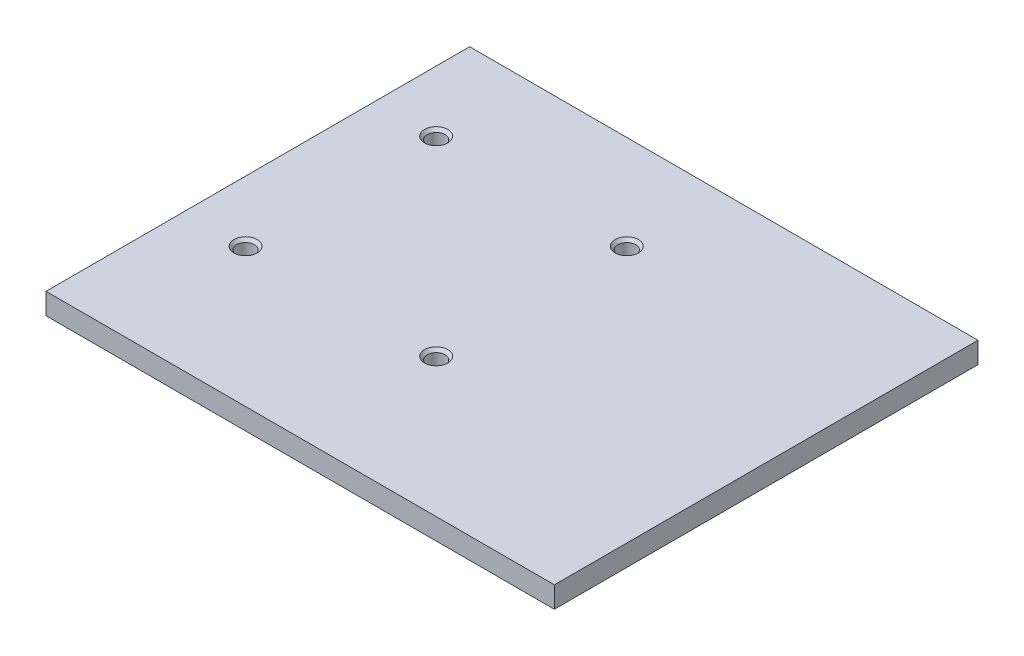
ISO-10303-21;
HEADER;
FILE_DESCRIPTION(('STEP AP214'),'2;1');
FILE_NAME('part.step','',(''),(''),'','','');
FILE_SCHEMA(('AUTOMOTIVE_DESIGN { 1 0 10303 214 1 1 1 1 }'));
ENDSEC;
DATA;
#1=APPLICATION_CONTEXT('core data for automotive mechanical design processes');
#2=APPLICATION_PROTOCOL_DEFINITION('international standard','automotive_design',2000,#1);
#3=PRODUCT_CONTEXT('',#1,'mechanical');
#4=PRODUCT('Part','Part','',(#3));
#5=PRODUCT_RELATED_PRODUCT_CATEGORY('part','',(#4));
#6=PRODUCT_DEFINITION_FORMATION('','',#4);
#7=PRODUCT_DEFINITION_CONTEXT('part definition',#1,'design');
#8=PRODUCT_DEFINITION('design','',#6,#7);
#9=PRODUCT_DEFINITION_SHAPE('','',#8);
#10=(LENGTH_UNIT() NAMED_UNIT(*) SI_UNIT(.MILLI.,.METRE.));
#11=(NAMED_UNIT(*) PLANE_ANGLE_UNIT() SI_UNIT($,.RADIAN.));
#12=(NAMED_UNIT(*) SI_UNIT($,.STERADIAN.) SOLID_ANGLE_UNIT());
#13=UNCERTAINTY_MEASURE_WITH_UNIT(LENGTH_MEASURE(1.E-05),#10,'distance_accuracy_value','');
#14=(GEOMETRIC_REPRESENTATION_CONTEXT(3) GLOBAL_UNCERTAINTY_ASSIGNED_CONTEXT((#13)) GLOBAL_UNIT_ASSIGNED_CONTEXT((#10,
#11,#12)) REPRESENTATION_CONTEXT('',''));
#15=CARTESIAN_POINT('',(0.,0.,0.));
#16=DIRECTION('',(0.,0.,1.));
#17=DIRECTION('',(1.,0.,0.));
#18=AXIS2_PLACEMENT_3D('',#15,#16,#17);
#19=CARTESIAN_POINT('',(-152.4,12.7,-127.));
#20=DIRECTION('',(1.,0.,0.));
#21=DIRECTION('',(0.,0.,-1.));
#22=AXIS2_PLACEMENT_3D('',#19,#20,#21);
#23=PLANE('',#22);
#24=DIRECTION('',(0.,0.,1.));
#25=VECTOR('',#24,1.);
#26=CARTESIAN_POINT('',(-152.4,0.,-127.));
#27=LINE('',#26,#25);
#28=CARTESIAN_POINT('',(-152.4,0.,-127.));
#29=VERTEX_POINT('',#28);
#30=CARTESIAN_POINT('',(-152.4,0.,127.));
#31=VERTEX_POINT('',#30);
#32=EDGE_CURVE('E102',#29,#31,#27,.T.);
#33=ORIENTED_EDGE('',*,*,#32,.T.);
#34=DIRECTION('',(0.,-1.,0.));
#35=VECTOR('',#34,1.);
#36=CARTESIAN_POINT('',(-152.4,12.7,127.));
#37=LINE('',#36,#35);
#38=CARTESIAN_POINT('',(-152.4,12.7,127.));
#39=VERTEX_POINT('',#38);
#40=EDGE_CURVE('E11',#39,#31,#37,.T.);
#41=ORIENTED_EDGE('',*,*,#40,.F.);
#42=DIRECTION('',(0.,0.,1.));
#43=VECTOR('',#42,1.);
#44=CARTESIAN_POINT('',(-152.4,12.7,-127.));
#45=LINE('',#44,#43);
#46=CARTESIAN_POINT('',(-152.4,12.7,-127.));
#47=VERTEX_POINT('',#46);
#48=EDGE_CURVE('E90',#47,#39,#45,.T.);
#49=ORIENTED_EDGE('',*,*,#48,.F.);
#50=DIRECTION('',(0.,-1.,0.));
#51=VECTOR('',#50,1.);
#52=CARTESIAN_POINT('',(-152.4,12.7,-127.));
#53=LINE('',#52,#51);
#54=EDGE_CURVE('E98',#47,#29,#53,.T.);
#55=ORIENTED_EDGE('',*,*,#54,.T.);
#56=EDGE_LOOP('',(#33,#41,#49,#55));
#57=FACE_BOUND('',#56,.T.);
#58=ADVANCED_FACE('F39',(#57),#23,.F.);
#59=CARTESIAN_POINT('',(-152.4,12.7,127.));
#60=DIRECTION('',(0.,0.,-1.));
#61=DIRECTION('',(-1.,0.,0.));
#62=AXIS2_PLACEMENT_3D('',#59,#60,#61);
#63=PLANE('',#62);
#64=DIRECTION('',(1.,0.,0.));
#65=VECTOR('',#64,1.);
#66=CARTESIAN_POINT('',(-152.4,0.,127.));
#67=LINE('',#66,#65);
#68=CARTESIAN_POINT('',(152.4,0.,127.));
#69=VERTEX_POINT('',#68);
#70=EDGE_CURVE('E94',#31,#69,#67,.T.);
#71=ORIENTED_EDGE('',*,*,#70,.T.);
#72=DIRECTION('',(0.,-1.,0.));
#73=VECTOR('',#72,1.);
#74=CARTESIAN_POINT('',(152.4,12.7,127.));
#75=LINE('',#74,#73);
#76=CARTESIAN_POINT('',(152.4,12.7,127.));
#77=VERTEX_POINT('',#76);
#78=EDGE_CURVE('E47',#77,#69,#75,.T.);
#79=ORIENTED_EDGE('',*,*,#78,.F.);
#80=DIRECTION('',(1.,0.,0.));
#81=VECTOR('',#80,1.);
#82=CARTESIAN_POINT('',(-152.4,12.7,127.));
#83=LINE('',#82,#81);
#84=EDGE_CURVE('E85',#39,#77,#83,.T.);
#85=ORIENTED_EDGE('',*,*,#84,.F.);
#86=ORIENTED_EDGE('',*,*,#40,.T.);
#87=EDGE_LOOP('',(#71,#79,#85,#86));
#88=FACE_BOUND('',#87,.T.);
#89=ADVANCED_FACE('F93',(#88),#63,.F.);
#90=CARTESIAN_POINT('',(152.4,12.7,-127.));
#91=DIRECTION('',(-1.,0.,0.));
#92=DIRECTION('',(0.,0.,1.));
#93=AXIS2_PLACEMENT_3D('',#90,#91,#92);
#94=PLANE('',#93);
#95=DIRECTION('',(0.,0.,-1.));
#96=VECTOR('',#95,1.);
#97=CARTESIAN_POINT('',(152.4,0.,-127.));
#98=LINE('',#97,#96);
#99=CARTESIAN_POINT('',(152.4,0.,-127.));
#100=VERTEX_POINT('',#99);
#101=EDGE_CURVE('E72',#69,#100,#98,.T.);
#102=ORIENTED_EDGE('',*,*,#101,.T.);
#103=DIRECTION('',(0.,-1.,0.));
#104=VECTOR('',#103,1.);
#105=CARTESIAN_POINT('',(152.4,12.7,-127.));
#106=LINE('',#105,#104);
#107=CARTESIAN_POINT('',(152.4,12.7,-127.));
#108=VERTEX_POINT('',#107);
#109=EDGE_CURVE('E95',#108,#100,#106,.T.);
#110=ORIENTED_EDGE('',*,*,#109,.F.);
#111=DIRECTION('',(0.,0.,-1.));
#112=VECTOR('',#111,1.);
#113=CARTESIAN_POINT('',(152.4,12.7,-127.));
#114=LINE('',#113,#112);
#115=EDGE_CURVE('E88',#77,#108,#114,.T.);
#116=ORIENTED_EDGE('',*,*,#115,.F.);
#117=ORIENTED_EDGE('',*,*,#78,.T.);
#118=EDGE_LOOP('',(#102,#110,#116,#117));
#119=FACE_BOUND('',#118,.T.);
#120=ADVANCED_FACE('F96',(#119),#94,.F.);
#121=CARTESIAN_POINT('',(-152.4,12.7,-127.));
#122=DIRECTION('',(0.,0.,1.));
#123=DIRECTION('',(1.,0.,0.));
#124=AXIS2_PLACEMENT_3D('',#121,#122,#123);
#125=PLANE('',#124);
#126=DIRECTION('',(-1.,0.,0.));
#127=VECTOR('',#126,1.);
#128=CARTESIAN_POINT('',(-152.4,0.,-127.));
#129=LINE('',#128,#127);
#130=EDGE_CURVE('E78',#100,#29,#129,.T.);
#131=ORIENTED_EDGE('',*,*,#130,.T.);
#132=ORIENTED_EDGE('',*,*,#54,.F.);
#133=DIRECTION('',(-1.,0.,0.));
#134=VECTOR('',#133,1.);
#135=CARTESIAN_POINT('',(-152.4,12.7,-127.));
#136=LINE('',#135,#134);
#137=EDGE_CURVE('E55',#108,#47,#136,.T.);
#138=ORIENTED_EDGE('',*,*,#137,.F.);
#139=ORIENTED_EDGE('',*,*,#109,.T.);
#140=EDGE_LOOP('',(#131,#132,#138,#139));
#141=FACE_BOUND('',#140,.T.);
#142=ADVANCED_FACE('F110',(#141),#125,.F.);
#143=CARTESIAN_POINT('',(0.,12.7,0.));
#144=DIRECTION('',(0.,1.,0.));
#145=DIRECTION('',(0.,0.,1.));
#146=AXIS2_PLACEMENT_3D('',#143,#144,#145);
#147=PLANE('',#146);
#148=CARTESIAN_POINT('',(-115.979474199942,12.7,-70.5188808451813));
#149=DIRECTION('',(0.,1.,0.));
#150=DIRECTION('',(0.,0.,1.));
#151=AXIS2_PLACEMENT_3D('',#148,#149,#150);
#152=CIRCLE('',#151,6.985);
#153=CARTESIAN_POINT('',(-115.979474199942,12.7,-63.5338808451813));
#154=VERTEX_POINT('',#153);
#155=EDGE_CURVE('E148',#154,#154,#152,.T.);
#156=ORIENTED_EDGE('',*,*,#155,.F.);
#157=EDGE_LOOP('',(#156));
#158=FACE_BOUND('',#157,.T.);
#159=CARTESIAN_POINT('',(-1.67947419994197,12.7,-70.5188808451813));
#160=DIRECTION('',(0.,1.,0.));
#161=DIRECTION('',(0.,0.,1.));
#162=AXIS2_PLACEMENT_3D('',#159,#160,#161);
#163=CIRCLE('',#162,6.985);
#164=CARTESIAN_POINT('',(-1.67947419994197,12.7,-63.5338808451813));
#165=VERTEX_POINT('',#164);
#166=EDGE_CURVE('E139',#165,#165,#163,.T.);
#167=ORIENTED_EDGE('',*,*,#166,.F.);
#168=EDGE_LOOP('',(#167));
#169=FACE_BOUND('',#168,.T.);
#170=CARTESIAN_POINT('',(-1.67947419994197,12.7,43.7811191548187));
#171=DIRECTION('',(0.,1.,0.));
#172=DIRECTION('',(0.,0.,1.));
#173=AXIS2_PLACEMENT_3D('',#170,#171,#172);
#174=CIRCLE('',#173,6.985);
#175=CARTESIAN_POINT('',(-1.67947419994197,12.7,50.7661191548187));
#176=VERTEX_POINT('',#175);
#177=EDGE_CURVE('E130',#176,#176,#174,.T.);
#178=ORIENTED_EDGE('',*,*,#177,.F.);
#179=EDGE_LOOP('',(#178));
#180=FACE_BOUND('',#179,.T.);
#181=CARTESIAN_POINT('',(-115.979474199942,12.7,43.7811191548188));
#182=DIRECTION('',(0.,1.,0.));
#183=DIRECTION('',(0.,0.,1.));
#184=AXIS2_PLACEMENT_3D('',#181,#182,#183);
#185=CIRCLE('',#184,6.985);
#186=CARTESIAN_POINT('',(-115.979474199942,12.7,50.7661191548188));
#187=VERTEX_POINT('',#186);
#188=EDGE_CURVE('E121',#187,#187,#185,.T.);
#189=ORIENTED_EDGE('',*,*,#188,.F.);
#190=EDGE_LOOP('',(#189));
#191=FACE_BOUND('',#190,.T.);
#192=ORIENTED_EDGE('',*,*,#48,.T.);
#193=ORIENTED_EDGE('',*,*,#84,.T.);
#194=ORIENTED_EDGE('',*,*,#115,.T.);
#195=ORIENTED_EDGE('',*,*,#137,.T.);
#196=EDGE_LOOP('',(#192,#193,#194,#195));
#197=FACE_BOUND('',#196,.T.);
#198=ADVANCED_FACE('F86',(#158,#169,#180,#191,#197),#147,.T.);
#199=CARTESIAN_POINT('',(0.,0.,0.));
#200=DIRECTION('',(0.,1.,0.));
#201=DIRECTION('',(0.,0.,1.));
#202=AXIS2_PLACEMENT_3D('',#199,#200,#201);
#203=PLANE('',#202);
#204=CARTESIAN_POINT('',(-115.979474199942,0.,-70.5188808451813));
#205=DIRECTION('',(0.,1.,0.));
#206=DIRECTION('',(0.,0.,1.));
#207=AXIS2_PLACEMENT_3D('',#204,#205,#206);
#208=CIRCLE('',#207,5.35813);
#209=CARTESIAN_POINT('',(-115.979474199942,0.,-65.1607508451813));
#210=VERTEX_POINT('',#209);
#211=EDGE_CURVE('E142',#210,#210,#208,.T.);
#212=ORIENTED_EDGE('',*,*,#211,.T.);
#213=EDGE_LOOP('',(#212));
#214=FACE_BOUND('',#213,.T.);
#215=CARTESIAN_POINT('',(-1.67947419994197,0.,-70.5188808451813));
#216=DIRECTION('',(0.,1.,0.));
#217=DIRECTION('',(0.,0.,1.));
#218=AXIS2_PLACEMENT_3D('',#215,#216,#217);
#219=CIRCLE('',#218,5.35813);
#220=CARTESIAN_POINT('',(-1.67947419994197,0.,-65.1607508451813));
#221=VERTEX_POINT('',#220);
#222=EDGE_CURVE('E133',#221,#221,#219,.T.);
#223=ORIENTED_EDGE('',*,*,#222,.T.);
#224=EDGE_LOOP('',(#223));
#225=FACE_BOUND('',#224,.T.);
#226=CARTESIAN_POINT('',(-1.67947419994197,0.,43.7811191548187));
#227=DIRECTION('',(0.,1.,0.));
#228=DIRECTION('',(0.,0.,1.));
#229=AXIS2_PLACEMENT_3D('',#226,#227,#228);
#230=CIRCLE('',#229,5.35813);
#231=CARTESIAN_POINT('',(-1.67947419994197,0.,49.1392491548187));
#232=VERTEX_POINT('',#231);
#233=EDGE_CURVE('E124',#232,#232,#230,.T.);
#234=ORIENTED_EDGE('',*,*,#233,.T.);
#235=EDGE_LOOP('',(#234));
#236=FACE_BOUND('',#235,.T.);
#237=CARTESIAN_POINT('',(-115.979474199942,0.,43.7811191548188));
#238=DIRECTION('',(0.,1.,0.));
#239=DIRECTION('',(0.,0.,1.));
#240=AXIS2_PLACEMENT_3D('',#237,#238,#239);
#241=CIRCLE('',#240,5.35813);
#242=CARTESIAN_POINT('',(-115.979474199942,0.,49.1392491548188));
#243=VERTEX_POINT('',#242);
#244=EDGE_CURVE('E105',#243,#243,#241,.T.);
#245=ORIENTED_EDGE('',*,*,#244,.T.);
#246=EDGE_LOOP('',(#245));
#247=FACE_BOUND('',#246,.T.);
#248=ORIENTED_EDGE('',*,*,#32,.F.);
#249=ORIENTED_EDGE('',*,*,#130,.F.);
#250=ORIENTED_EDGE('',*,*,#101,.F.);
#251=ORIENTED_EDGE('',*,*,#70,.F.);
#252=EDGE_LOOP('',(#248,#249,#250,#251));
#253=FACE_BOUND('',#252,.T.);
#254=ADVANCED_FACE('F113',(#214,#225,#236,#247,#253),#203,.F.);
#255=CARTESIAN_POINT('',(-115.979474199942,12.7,43.7811191548188));
#256=DIRECTION('',(0.,1.,0.));
#257=DIRECTION('',(0.,0.,1.));
#258=AXIS2_PLACEMENT_3D('',#255,#256,#257);
#259=CYLINDRICAL_SURFACE('',#258,5.35813);
#260=ORIENTED_EDGE('',*,*,#244,.F.);
#261=EDGE_LOOP('',(#260));
#262=FACE_BOUND('',#261,.T.);
#263=CARTESIAN_POINT('',(-115.979474199942,10.8285001493444,43.7811191548188));
#264=DIRECTION('',(0.,1.,0.));
#265=DIRECTION('',(0.,0.,1.));
#266=AXIS2_PLACEMENT_3D('',#263,#264,#265);
#267=CIRCLE('',#266,5.35813);
#268=CARTESIAN_POINT('',(-115.979474199942,10.8285001493444,49.1392491548188));
#269=VERTEX_POINT('',#268);
#270=EDGE_CURVE('E118',#269,#269,#267,.T.);
#271=ORIENTED_EDGE('',*,*,#270,.T.);
#272=EDGE_LOOP('',(#271));
#273=FACE_BOUND('',#272,.T.);
#274=ADVANCED_FACE('F166',(#262,#273),#259,.F.);
#275=CARTESIAN_POINT('',(-115.979474199942,12.7,43.7811191548188));
#276=DIRECTION('',(0.,1.,0.));
#277=DIRECTION('',(0.,0.,1.));
#278=AXIS2_PLACEMENT_3D('',#275,#276,#277);
#279=CONICAL_SURFACE('',#278,6.985,0.715584993317676);
#280=ORIENTED_EDGE('',*,*,#270,.F.);
#281=EDGE_LOOP('',(#280));
#282=FACE_BOUND('',#281,.T.);
#283=ORIENTED_EDGE('',*,*,#188,.T.);
#284=EDGE_LOOP('',(#283));
#285=FACE_BOUND('',#284,.T.);
#286=ADVANCED_FACE('F163',(#282,#285),#279,.F.);
#287=CARTESIAN_POINT('',(-1.67947419994197,12.7,43.7811191548187));
#288=DIRECTION('',(0.,1.,0.));
#289=DIRECTION('',(0.,0.,1.));
#290=AXIS2_PLACEMENT_3D('',#287,#288,#289);
#291=CYLINDRICAL_SURFACE('',#290,5.35813);
#292=ORIENTED_EDGE('',*,*,#233,.F.);
#293=EDGE_LOOP('',(#292));
#294=FACE_BOUND('',#293,.T.);
#295=CARTESIAN_POINT('',(-1.67947419994197,10.8285001493444,43.7811191548187));
#296=DIRECTION('',(0.,1.,0.));
#297=DIRECTION('',(0.,0.,1.));
#298=AXIS2_PLACEMENT_3D('',#295,#296,#297);
#299=CIRCLE('',#298,5.35813);
#300=CARTESIAN_POINT('',(-1.67947419994197,10.8285001493444,49.1392491548187));
#301=VERTEX_POINT('',#300);
#302=EDGE_CURVE('E127',#301,#301,#299,.T.);
#303=ORIENTED_EDGE('',*,*,#302,.T.);
#304=EDGE_LOOP('',(#303));
#305=FACE_BOUND('',#304,.T.);
#306=ADVANCED_FACE('F165',(#294,#305),#291,.F.);
#307=CARTESIAN_POINT('',(-1.67947419994197,12.7,43.7811191548187));
#308=DIRECTION('',(0.,1.,0.));
#309=DIRECTION('',(0.,0.,1.));
#310=AXIS2_PLACEMENT_3D('',#307,#308,#309);
#311=CONICAL_SURFACE('',#310,6.985,0.715584993317677);
#312=ORIENTED_EDGE('',*,*,#302,.F.);
#313=EDGE_LOOP('',(#312));
#314=FACE_BOUND('',#313,.T.);
#315=ORIENTED_EDGE('',*,*,#177,.T.);
#316=EDGE_LOOP('',(#315));
#317=FACE_BOUND('',#316,.T.);
#318=ADVANCED_FACE('F173',(#314,#317),#311,.F.);
#319=CARTESIAN_POINT('',(-1.67947419994197,12.7,-70.5188808451813));
#320=DIRECTION('',(0.,1.,0.));
#321=DIRECTION('',(0.,0.,1.));
#322=AXIS2_PLACEMENT_3D('',#319,#320,#321);
#323=CYLINDRICAL_SURFACE('',#322,5.35813);
#324=ORIENTED_EDGE('',*,*,#222,.F.);
#325=EDGE_LOOP('',(#324));
#326=FACE_BOUND('',#325,.T.);
#327=CARTESIAN_POINT('',(-1.67947419994197,10.8285001493444,-70.5188808451813));
#328=DIRECTION('',(0.,1.,0.));
#329=DIRECTION('',(0.,0.,1.));
#330=AXIS2_PLACEMENT_3D('',#327,#328,#329);
#331=CIRCLE('',#330,5.35813);
#332=CARTESIAN_POINT('',(-1.67947419994197,10.8285001493444,-65.1607508451813));
#333=VERTEX_POINT('',#332);
#334=EDGE_CURVE('E136',#333,#333,#331,.T.);
#335=ORIENTED_EDGE('',*,*,#334,.T.);
#336=EDGE_LOOP('',(#335));
#337=FACE_BOUND('',#336,.T.);
#338=ADVANCED_FACE('F208',(#326,#337),#323,.F.);
#339=CARTESIAN_POINT('',(-1.67947419994197,12.7,-70.5188808451813));
#340=DIRECTION('',(0.,1.,0.));
#341=DIRECTION('',(0.,0.,1.));
#342=AXIS2_PLACEMENT_3D('',#339,#340,#341);
#343=CONICAL_SURFACE('',#342,6.985,0.715584993317677);
#344=ORIENTED_EDGE('',*,*,#334,.F.);
#345=EDGE_LOOP('',(#344));
#346=FACE_BOUND('',#345,.T.);
#347=ORIENTED_EDGE('',*,*,#166,.T.);
#348=EDGE_LOOP('',(#347));
#349=FACE_BOUND('',#348,.T.);
#350=ADVANCED_FACE('F213',(#346,#349),#343,.F.);
#351=CARTESIAN_POINT('',(-115.979474199942,12.7,-70.5188808451813));
#352=DIRECTION('',(0.,1.,0.));
#353=DIRECTION('',(0.,0.,1.));
#354=AXIS2_PLACEMENT_3D('',#351,#352,#353);
#355=CYLINDRICAL_SURFACE('',#354,5.35813);
#356=ORIENTED_EDGE('',*,*,#211,.F.);
#357=EDGE_LOOP('',(#356));
#358=FACE_BOUND('',#357,.T.);
#359=CARTESIAN_POINT('',(-115.979474199942,10.8285001493444,-70.5188808451813));
#360=DIRECTION('',(0.,1.,0.));
#361=DIRECTION('',(0.,0.,1.));
#362=AXIS2_PLACEMENT_3D('',#359,#360,#361);
#363=CIRCLE('',#362,5.35812999999999);
#364=CARTESIAN_POINT('',(-115.979474199942,10.8285001493444,-65.1607508451813));
#365=VERTEX_POINT('',#364);
#366=EDGE_CURVE('E145',#365,#365,#363,.T.);
#367=ORIENTED_EDGE('',*,*,#366,.T.);
#368=EDGE_LOOP('',(#367));
#369=FACE_BOUND('',#368,.T.);
#370=ADVANCED_FACE('F219',(#358,#369),#355,.F.);
#371=CARTESIAN_POINT('',(-115.979474199942,12.7,-70.5188808451813));
#372=DIRECTION('',(0.,1.,0.));
#373=DIRECTION('',(0.,0.,1.));
#374=AXIS2_PLACEMENT_3D('',#371,#372,#373);
#375=CONICAL_SURFACE('',#374,6.985,0.715584993317681);
#376=ORIENTED_EDGE('',*,*,#366,.F.);
#377=EDGE_LOOP('',(#376));
#378=FACE_BOUND('',#377,.T.);
#379=ORIENTED_EDGE('',*,*,#155,.T.);
#380=EDGE_LOOP('',(#379));
#381=FACE_BOUND('',#380,.T.);
#382=ADVANCED_FACE('F152',(#378,#381),#375,.F.);
#383=CLOSED_SHELL('',(#58,#89,#120,#142,#198,#254,#274,#286,#306,#318,#338,#350,#370,#382));
#384=MANIFOLD_SOLID_BREP('B2',#383);
#385=ADVANCED_BREP_SHAPE_REPRESENTATION('',(#18,#384),#14);
#386=SHAPE_DEFINITION_REPRESENTATION(#9,#385);
ENDSEC;
END-ISO-10303-21;
